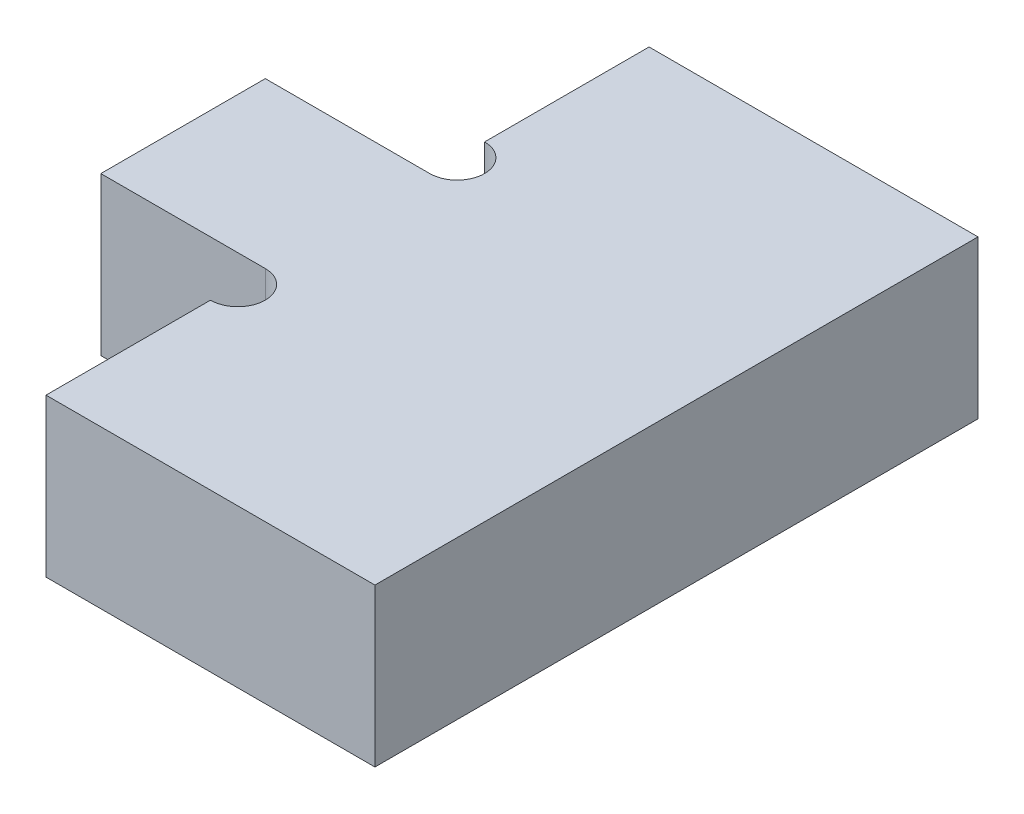
ISO-10303-21;
HEADER;
FILE_DESCRIPTION(('STEP AP214'),'2;1');
FILE_NAME('part.step','',(''),(''),'','','');
FILE_SCHEMA(('AUTOMOTIVE_DESIGN { 1 0 10303 214 1 1 1 1 }'));
ENDSEC;
DATA;
#1=APPLICATION_CONTEXT('core data for automotive mechanical design processes');
#2=APPLICATION_PROTOCOL_DEFINITION('international standard','automotive_design',2000,#1);
#3=PRODUCT_CONTEXT('',#1,'mechanical');
#4=PRODUCT('Part','Part','',(#3));
#5=PRODUCT_RELATED_PRODUCT_CATEGORY('part','',(#4));
#6=PRODUCT_DEFINITION_FORMATION('','',#4);
#7=PRODUCT_DEFINITION_CONTEXT('part definition',#1,'design');
#8=PRODUCT_DEFINITION('design','',#6,#7);
#9=PRODUCT_DEFINITION_SHAPE('','',#8);
#10=(LENGTH_UNIT() NAMED_UNIT(*) SI_UNIT(.MILLI.,.METRE.));
#11=(NAMED_UNIT(*) PLANE_ANGLE_UNIT() SI_UNIT($,.RADIAN.));
#12=(NAMED_UNIT(*) SI_UNIT($,.STERADIAN.) SOLID_ANGLE_UNIT());
#13=UNCERTAINTY_MEASURE_WITH_UNIT(LENGTH_MEASURE(1.E-05),#10,'distance_accuracy_value','');
#14=(GEOMETRIC_REPRESENTATION_CONTEXT(3) GLOBAL_UNCERTAINTY_ASSIGNED_CONTEXT((#13)) GLOBAL_UNIT_ASSIGNED_CONTEXT((#10,
#11,#12)) REPRESENTATION_CONTEXT('',''));
#15=CARTESIAN_POINT('',(0.,0.,0.));
#16=DIRECTION('',(0.,0.,1.));
#17=DIRECTION('',(1.,0.,0.));
#18=AXIS2_PLACEMENT_3D('',#15,#16,#17);
#19=CARTESIAN_POINT('',(7.93749999999887,18.25625,-34.9250000000001));
#20=DIRECTION('',(0.,0.,1.));
#21=DIRECTION('',(1.,0.,0.));
#22=AXIS2_PLACEMENT_3D('',#19,#20,#21);
#23=PLANE('',#22);
#24=DIRECTION('',(-1.,0.,0.));
#25=VECTOR('',#24,1.);
#26=CARTESIAN_POINT('',(7.93749999999887,0.,-34.9250000000001));
#27=LINE('',#26,#25);
#28=CARTESIAN_POINT('',(46.0374999999989,0.,-34.9250000000001));
#29=VERTEX_POINT('',#28);
#30=CARTESIAN_POINT('',(7.93749999999887,0.,-34.9250000000001));
#31=VERTEX_POINT('',#30);
#32=EDGE_CURVE('E158',#29,#31,#27,.T.);
#33=ORIENTED_EDGE('',*,*,#32,.T.);
#34=DIRECTION('',(0.,-1.,0.));
#35=VECTOR('',#34,1.);
#36=CARTESIAN_POINT('',(7.93749999999887,18.25625,-34.9250000000001));
#37=LINE('',#36,#35);
#38=CARTESIAN_POINT('',(7.93749999999887,18.25625,-34.9250000000001));
#39=VERTEX_POINT('',#38);
#40=EDGE_CURVE('E11',#39,#31,#37,.T.);
#41=ORIENTED_EDGE('',*,*,#40,.F.);
#42=DIRECTION('',(-1.,0.,0.));
#43=VECTOR('',#42,1.);
#44=CARTESIAN_POINT('',(7.93749999999887,18.25625,-34.9250000000001));
#45=LINE('',#44,#43);
#46=CARTESIAN_POINT('',(46.0374999999989,18.25625,-34.9250000000001));
#47=VERTEX_POINT('',#46);
#48=EDGE_CURVE('E186',#47,#39,#45,.T.);
#49=ORIENTED_EDGE('',*,*,#48,.F.);
#50=DIRECTION('',(0.,-1.,0.));
#51=VECTOR('',#50,1.);
#52=CARTESIAN_POINT('',(46.0374999999989,18.25625,-34.9250000000001));
#53=LINE('',#52,#51);
#54=EDGE_CURVE('E154',#47,#29,#53,.T.);
#55=ORIENTED_EDGE('',*,*,#54,.T.);
#56=EDGE_LOOP('',(#33,#41,#49,#55));
#57=FACE_BOUND('',#56,.T.);
#58=ADVANCED_FACE('F45',(#57),#23,.F.);
#59=CARTESIAN_POINT('',(7.93749999999887,18.25625,-34.9250000000001));
#60=DIRECTION('',(1.,0.,0.));
#61=DIRECTION('',(0.,0.,-1.));
#62=AXIS2_PLACEMENT_3D('',#59,#60,#61);
#63=PLANE('',#62);
#64=DIRECTION('',(0.,0.,1.));
#65=VECTOR('',#64,1.);
#66=CARTESIAN_POINT('',(7.93749999999887,0.,-34.9250000000001));
#67=LINE('',#66,#65);
#68=CARTESIAN_POINT('',(7.93749999999899,0.,-15.8750000000001));
#69=VERTEX_POINT('',#68);
#70=EDGE_CURVE('E162',#31,#69,#67,.T.);
#71=ORIENTED_EDGE('',*,*,#70,.T.);
#72=DIRECTION('',(0.,-1.,0.));
#73=VECTOR('',#72,1.);
#74=CARTESIAN_POINT('',(7.93749999999899,18.25625,-15.8750000000001));
#75=LINE('',#74,#73);
#76=CARTESIAN_POINT('',(7.93749999999899,18.25625,-15.8750000000001));
#77=VERTEX_POINT('',#76);
#78=EDGE_CURVE('E54',#77,#69,#75,.T.);
#79=ORIENTED_EDGE('',*,*,#78,.F.);
#80=DIRECTION('',(0.,0.,1.));
#81=VECTOR('',#80,1.);
#82=CARTESIAN_POINT('',(7.93749999999887,18.25625,-34.9250000000001));
#83=LINE('',#82,#81);
#84=EDGE_CURVE('E111',#39,#77,#83,.T.);
#85=ORIENTED_EDGE('',*,*,#84,.F.);
#86=ORIENTED_EDGE('',*,*,#40,.T.);
#87=EDGE_LOOP('',(#71,#79,#85,#86));
#88=FACE_BOUND('',#87,.T.);
#89=ADVANCED_FACE('F250',(#88),#63,.F.);
#90=CARTESIAN_POINT('',(7.93749999999999,18.25625,-12.7));
#91=DIRECTION('',(0.,-1.,0.));
#92=DIRECTION('',(0.,0.,-1.));
#93=AXIS2_PLACEMENT_3D('',#90,#91,#92);
#94=CYLINDRICAL_SURFACE('',#93,3.17500000000004);
#95=CARTESIAN_POINT('',(7.93749999999999,0.,-12.7));
#96=DIRECTION('',(0.,-1.,0.));
#97=DIRECTION('',(0.,0.,1.));
#98=AXIS2_PLACEMENT_3D('',#95,#96,#97);
#99=CIRCLE('',#98,3.17500000000004);
#100=CARTESIAN_POINT('',(7.93749999999999,0.,-9.52500000000001));
#101=VERTEX_POINT('',#100);
#102=EDGE_CURVE('E165',#69,#101,#99,.T.);
#103=ORIENTED_EDGE('',*,*,#102,.T.);
#104=DIRECTION('',(0.,-1.,0.));
#105=VECTOR('',#104,1.);
#106=CARTESIAN_POINT('',(7.93749999999999,18.25625,-9.52500000000001));
#107=LINE('',#106,#105);
#108=CARTESIAN_POINT('',(7.93749999999999,18.25625,-9.52500000000001));
#109=VERTEX_POINT('',#108);
#110=EDGE_CURVE('E205',#109,#101,#107,.T.);
#111=ORIENTED_EDGE('',*,*,#110,.F.);
#112=CARTESIAN_POINT('',(7.93749999999999,18.25625,-12.7));
#113=DIRECTION('',(0.,-1.,0.));
#114=DIRECTION('',(0.,0.,1.));
#115=AXIS2_PLACEMENT_3D('',#112,#113,#114);
#116=CIRCLE('',#115,3.17500000000004);
#117=EDGE_CURVE('E215',#77,#109,#116,.T.);
#118=ORIENTED_EDGE('',*,*,#117,.F.);
#119=ORIENTED_EDGE('',*,*,#78,.T.);
#120=EDGE_LOOP('',(#103,#111,#118,#119));
#121=FACE_BOUND('',#120,.T.);
#122=ADVANCED_FACE('F213',(#121),#94,.F.);
#123=CARTESIAN_POINT('',(7.93749999999999,18.25625,-9.52500000000001));
#124=DIRECTION('',(0.,0.,1.));
#125=DIRECTION('',(1.,0.,0.));
#126=AXIS2_PLACEMENT_3D('',#123,#124,#125);
#127=PLANE('',#126);
#128=DIRECTION('',(-1.,0.,0.));
#129=VECTOR('',#128,1.);
#130=CARTESIAN_POINT('',(7.93749999999999,0.,-9.52500000000001));
#131=LINE('',#130,#129);
#132=CARTESIAN_POINT('',(-11.1125,0.,-9.52500000000001));
#133=VERTEX_POINT('',#132);
#134=EDGE_CURVE('E168',#101,#133,#131,.T.);
#135=ORIENTED_EDGE('',*,*,#134,.T.);
#136=DIRECTION('',(0.,-1.,0.));
#137=VECTOR('',#136,1.);
#138=CARTESIAN_POINT('',(-11.1125,18.25625,-9.52500000000001));
#139=LINE('',#138,#137);
#140=CARTESIAN_POINT('',(-11.1125,18.25625,-9.52500000000001));
#141=VERTEX_POINT('',#140);
#142=EDGE_CURVE('E201',#141,#133,#139,.T.);
#143=ORIENTED_EDGE('',*,*,#142,.F.);
#144=DIRECTION('',(-1.,0.,0.));
#145=VECTOR('',#144,1.);
#146=CARTESIAN_POINT('',(7.93749999999999,18.25625,-9.52500000000001));
#147=LINE('',#146,#145);
#148=EDGE_CURVE('E234',#109,#141,#147,.T.);
#149=ORIENTED_EDGE('',*,*,#148,.F.);
#150=ORIENTED_EDGE('',*,*,#110,.T.);
#151=EDGE_LOOP('',(#135,#143,#149,#150));
#152=FACE_BOUND('',#151,.T.);
#153=ADVANCED_FACE('F224',(#152),#127,.F.);
#154=CARTESIAN_POINT('',(-11.1125,18.25625,-9.52500000000001));
#155=DIRECTION('',(1.,0.,0.));
#156=DIRECTION('',(0.,0.,-1.));
#157=AXIS2_PLACEMENT_3D('',#154,#155,#156);
#158=PLANE('',#157);
#159=DIRECTION('',(0.,0.,1.));
#160=VECTOR('',#159,1.);
#161=CARTESIAN_POINT('',(-11.1125,0.,-9.52500000000001));
#162=LINE('',#161,#160);
#163=CARTESIAN_POINT('',(-11.1125,0.,9.52500000000001));
#164=VERTEX_POINT('',#163);
#165=EDGE_CURVE('E171',#133,#164,#162,.T.);
#166=ORIENTED_EDGE('',*,*,#165,.T.);
#167=DIRECTION('',(0.,-1.,0.));
#168=VECTOR('',#167,1.);
#169=CARTESIAN_POINT('',(-11.1125,18.25625,9.52500000000001));
#170=LINE('',#169,#168);
#171=CARTESIAN_POINT('',(-11.1125,18.25625,9.52500000000001));
#172=VERTEX_POINT('',#171);
#173=EDGE_CURVE('E197',#172,#164,#170,.T.);
#174=ORIENTED_EDGE('',*,*,#173,.F.);
#175=DIRECTION('',(0.,0.,1.));
#176=VECTOR('',#175,1.);
#177=CARTESIAN_POINT('',(-11.1125,18.25625,-9.52500000000001));
#178=LINE('',#177,#176);
#179=EDGE_CURVE('E230',#141,#172,#178,.T.);
#180=ORIENTED_EDGE('',*,*,#179,.F.);
#181=ORIENTED_EDGE('',*,*,#142,.T.);
#182=EDGE_LOOP('',(#166,#174,#180,#181));
#183=FACE_BOUND('',#182,.T.);
#184=ADVANCED_FACE('F228',(#183),#158,.F.);
#185=CARTESIAN_POINT('',(-11.1125,18.25625,9.52500000000001));
#186=DIRECTION('',(0.,0.,-1.));
#187=DIRECTION('',(-1.,0.,0.));
#188=AXIS2_PLACEMENT_3D('',#185,#186,#187);
#189=PLANE('',#188);
#190=DIRECTION('',(1.,0.,0.));
#191=VECTOR('',#190,1.);
#192=CARTESIAN_POINT('',(-11.1125,0.,9.52500000000001));
#193=LINE('',#192,#191);
#194=CARTESIAN_POINT('',(7.93749999999999,0.,9.52500000000001));
#195=VERTEX_POINT('',#194);
#196=EDGE_CURVE('E174',#164,#195,#193,.T.);
#197=ORIENTED_EDGE('',*,*,#196,.T.);
#198=DIRECTION('',(0.,-1.,0.));
#199=VECTOR('',#198,1.);
#200=CARTESIAN_POINT('',(7.93749999999999,18.25625,9.52500000000001));
#201=LINE('',#200,#199);
#202=CARTESIAN_POINT('',(7.93749999999999,18.25625,9.52500000000001));
#203=VERTEX_POINT('',#202);
#204=EDGE_CURVE('E193',#203,#195,#201,.T.);
#205=ORIENTED_EDGE('',*,*,#204,.F.);
#206=DIRECTION('',(1.,0.,0.));
#207=VECTOR('',#206,1.);
#208=CARTESIAN_POINT('',(-11.1125,18.25625,9.52500000000001));
#209=LINE('',#208,#207);
#210=EDGE_CURVE('E233',#172,#203,#209,.T.);
#211=ORIENTED_EDGE('',*,*,#210,.F.);
#212=ORIENTED_EDGE('',*,*,#173,.T.);
#213=EDGE_LOOP('',(#197,#205,#211,#212));
#214=FACE_BOUND('',#213,.T.);
#215=ADVANCED_FACE('F262',(#214),#189,.F.);
#216=CARTESIAN_POINT('',(7.93749999999999,18.25625,12.6999999999999));
#217=DIRECTION('',(0.,-1.,0.));
#218=DIRECTION('',(0.,0.,-1.));
#219=AXIS2_PLACEMENT_3D('',#216,#217,#218);
#220=CYLINDRICAL_SURFACE('',#219,3.17499999999998);
#221=CARTESIAN_POINT('',(7.93749999999999,0.,12.6999999999999));
#222=DIRECTION('',(0.,-1.,0.));
#223=DIRECTION('',(0.,0.,1.));
#224=AXIS2_PLACEMENT_3D('',#221,#222,#223);
#225=CIRCLE('',#224,3.17499999999998);
#226=CARTESIAN_POINT('',(7.93749999999915,0.,15.8749999999999));
#227=VERTEX_POINT('',#226);
#228=EDGE_CURVE('E177',#195,#227,#225,.T.);
#229=ORIENTED_EDGE('',*,*,#228,.T.);
#230=DIRECTION('',(0.,-1.,0.));
#231=VECTOR('',#230,1.);
#232=CARTESIAN_POINT('',(7.93749999999915,18.25625,15.8749999999999));
#233=LINE('',#232,#231);
#234=CARTESIAN_POINT('',(7.93749999999915,18.25625,15.8749999999999));
#235=VERTEX_POINT('',#234);
#236=EDGE_CURVE('E147',#235,#227,#233,.T.);
#237=ORIENTED_EDGE('',*,*,#236,.F.);
#238=CARTESIAN_POINT('',(7.93749999999999,18.25625,12.6999999999999));
#239=DIRECTION('',(0.,-1.,0.));
#240=DIRECTION('',(0.,0.,1.));
#241=AXIS2_PLACEMENT_3D('',#238,#239,#240);
#242=CIRCLE('',#241,3.17499999999998);
#243=EDGE_CURVE('E136',#203,#235,#242,.T.);
#244=ORIENTED_EDGE('',*,*,#243,.F.);
#245=ORIENTED_EDGE('',*,*,#204,.T.);
#246=EDGE_LOOP('',(#229,#237,#244,#245));
#247=FACE_BOUND('',#246,.T.);
#248=ADVANCED_FACE('F265',(#247),#220,.F.);
#249=CARTESIAN_POINT('',(7.93749999999915,18.25625,15.875));
#250=DIRECTION('',(1.,0.,0.));
#251=DIRECTION('',(0.,0.,-1.));
#252=AXIS2_PLACEMENT_3D('',#249,#250,#251);
#253=PLANE('',#252);
#254=DIRECTION('',(0.,0.,1.));
#255=VECTOR('',#254,1.);
#256=CARTESIAN_POINT('',(7.93749999999915,0.,15.875));
#257=LINE('',#256,#255);
#258=CARTESIAN_POINT('',(7.9374999999993,0.,34.9250000000001));
#259=VERTEX_POINT('',#258);
#260=EDGE_CURVE('E145',#227,#259,#257,.T.);
#261=ORIENTED_EDGE('',*,*,#260,.T.);
#262=DIRECTION('',(0.,-1.,0.));
#263=VECTOR('',#262,1.);
#264=CARTESIAN_POINT('',(7.9374999999993,18.25625,34.9250000000001));
#265=LINE('',#264,#263);
#266=CARTESIAN_POINT('',(7.9374999999993,18.25625,34.9250000000001));
#267=VERTEX_POINT('',#266);
#268=EDGE_CURVE('E142',#267,#259,#265,.T.);
#269=ORIENTED_EDGE('',*,*,#268,.F.);
#270=DIRECTION('',(0.,0.,1.));
#271=VECTOR('',#270,1.);
#272=CARTESIAN_POINT('',(7.93749999999915,18.25625,15.875));
#273=LINE('',#272,#271);
#274=EDGE_CURVE('E130',#235,#267,#273,.T.);
#275=ORIENTED_EDGE('',*,*,#274,.F.);
#276=ORIENTED_EDGE('',*,*,#236,.T.);
#277=EDGE_LOOP('',(#261,#269,#275,#276));
#278=FACE_BOUND('',#277,.T.);
#279=ADVANCED_FACE('F143',(#278),#253,.F.);
#280=CARTESIAN_POINT('',(46.0374999999989,18.25625,34.9250000000001));
#281=DIRECTION('',(0.,0.,-1.));
#282=DIRECTION('',(-1.,0.,0.));
#283=AXIS2_PLACEMENT_3D('',#280,#281,#282);
#284=PLANE('',#283);
#285=DIRECTION('',(1.,0.,0.));
#286=VECTOR('',#285,1.);
#287=CARTESIAN_POINT('',(46.0374999999989,0.,34.9250000000001));
#288=LINE('',#287,#286);
#289=CARTESIAN_POINT('',(46.0374999999989,0.,34.9250000000001));
#290=VERTEX_POINT('',#289);
#291=EDGE_CURVE('E97',#259,#290,#288,.T.);
#292=ORIENTED_EDGE('',*,*,#291,.T.);
#293=DIRECTION('',(0.,-1.,0.));
#294=VECTOR('',#293,1.);
#295=CARTESIAN_POINT('',(46.0374999999989,18.25625,34.9250000000001));
#296=LINE('',#295,#294);
#297=CARTESIAN_POINT('',(46.0374999999989,18.25625,34.9250000000001));
#298=VERTEX_POINT('',#297);
#299=EDGE_CURVE('E148',#298,#290,#296,.T.);
#300=ORIENTED_EDGE('',*,*,#299,.F.);
#301=DIRECTION('',(1.,0.,0.));
#302=VECTOR('',#301,1.);
#303=CARTESIAN_POINT('',(46.0374999999989,18.25625,34.9250000000001));
#304=LINE('',#303,#302);
#305=EDGE_CURVE('E134',#267,#298,#304,.T.);
#306=ORIENTED_EDGE('',*,*,#305,.F.);
#307=ORIENTED_EDGE('',*,*,#268,.T.);
#308=EDGE_LOOP('',(#292,#300,#306,#307));
#309=FACE_BOUND('',#308,.T.);
#310=ADVANCED_FACE('F150',(#309),#284,.F.);
#311=CARTESIAN_POINT('',(46.0374999999989,18.25625,-34.9250000000001));
#312=DIRECTION('',(-1.,0.,0.));
#313=DIRECTION('',(0.,0.,1.));
#314=AXIS2_PLACEMENT_3D('',#311,#312,#313);
#315=PLANE('',#314);
#316=DIRECTION('',(0.,0.,-1.));
#317=VECTOR('',#316,1.);
#318=CARTESIAN_POINT('',(46.0374999999989,0.,-34.9250000000001));
#319=LINE('',#318,#317);
#320=EDGE_CURVE('E103',#290,#29,#319,.T.);
#321=ORIENTED_EDGE('',*,*,#320,.T.);
#322=ORIENTED_EDGE('',*,*,#54,.F.);
#323=DIRECTION('',(0.,0.,-1.));
#324=VECTOR('',#323,1.);
#325=CARTESIAN_POINT('',(46.0374999999989,18.25625,-34.9250000000001));
#326=LINE('',#325,#324);
#327=EDGE_CURVE('E62',#298,#47,#326,.T.);
#328=ORIENTED_EDGE('',*,*,#327,.F.);
#329=ORIENTED_EDGE('',*,*,#299,.T.);
#330=EDGE_LOOP('',(#321,#322,#328,#329));
#331=FACE_BOUND('',#330,.T.);
#332=ADVANCED_FACE('F274',(#331),#315,.F.);
#333=CARTESIAN_POINT('',(7.93749999999999,18.25625,12.6999999999999));
#334=DIRECTION('',(0.,1.,0.));
#335=DIRECTION('',(0.,0.,1.));
#336=AXIS2_PLACEMENT_3D('',#333,#334,#335);
#337=PLANE('',#336);
#338=ORIENTED_EDGE('',*,*,#48,.T.);
#339=ORIENTED_EDGE('',*,*,#84,.T.);
#340=ORIENTED_EDGE('',*,*,#117,.T.);
#341=ORIENTED_EDGE('',*,*,#148,.T.);
#342=ORIENTED_EDGE('',*,*,#179,.T.);
#343=ORIENTED_EDGE('',*,*,#210,.T.);
#344=ORIENTED_EDGE('',*,*,#243,.T.);
#345=ORIENTED_EDGE('',*,*,#274,.T.);
#346=ORIENTED_EDGE('',*,*,#305,.T.);
#347=ORIENTED_EDGE('',*,*,#327,.T.);
#348=EDGE_LOOP('',(#338,#339,#340,#341,#342,#343,#344,#345,#346,#347));
#349=FACE_BOUND('',#348,.T.);
#350=ADVANCED_FACE('F132',(#349),#337,.T.);
#351=CARTESIAN_POINT('',(7.93749999999999,0.,12.6999999999999));
#352=DIRECTION('',(0.,1.,0.));
#353=DIRECTION('',(0.,0.,1.));
#354=AXIS2_PLACEMENT_3D('',#351,#352,#353);
#355=PLANE('',#354);
#356=ORIENTED_EDGE('',*,*,#32,.F.);
#357=ORIENTED_EDGE('',*,*,#320,.F.);
#358=ORIENTED_EDGE('',*,*,#291,.F.);
#359=ORIENTED_EDGE('',*,*,#260,.F.);
#360=ORIENTED_EDGE('',*,*,#228,.F.);
#361=ORIENTED_EDGE('',*,*,#196,.F.);
#362=ORIENTED_EDGE('',*,*,#165,.F.);
#363=ORIENTED_EDGE('',*,*,#134,.F.);
#364=ORIENTED_EDGE('',*,*,#102,.F.);
#365=ORIENTED_EDGE('',*,*,#70,.F.);
#366=EDGE_LOOP('',(#356,#357,#358,#359,#360,#361,#362,#363,#364,#365));
#367=FACE_BOUND('',#366,.T.);
#368=ADVANCED_FACE('F219',(#367),#355,.F.);
#369=CLOSED_SHELL('',(#58,#89,#122,#153,#184,#215,#248,#279,#310,#332,#350,#368));
#370=MANIFOLD_SOLID_BREP('B2',#369);
#371=ADVANCED_BREP_SHAPE_REPRESENTATION('',(#18,#370),#14);
#372=SHAPE_DEFINITION_REPRESENTATION(#9,#371);
ENDSEC;
END-ISO-10303-21;
